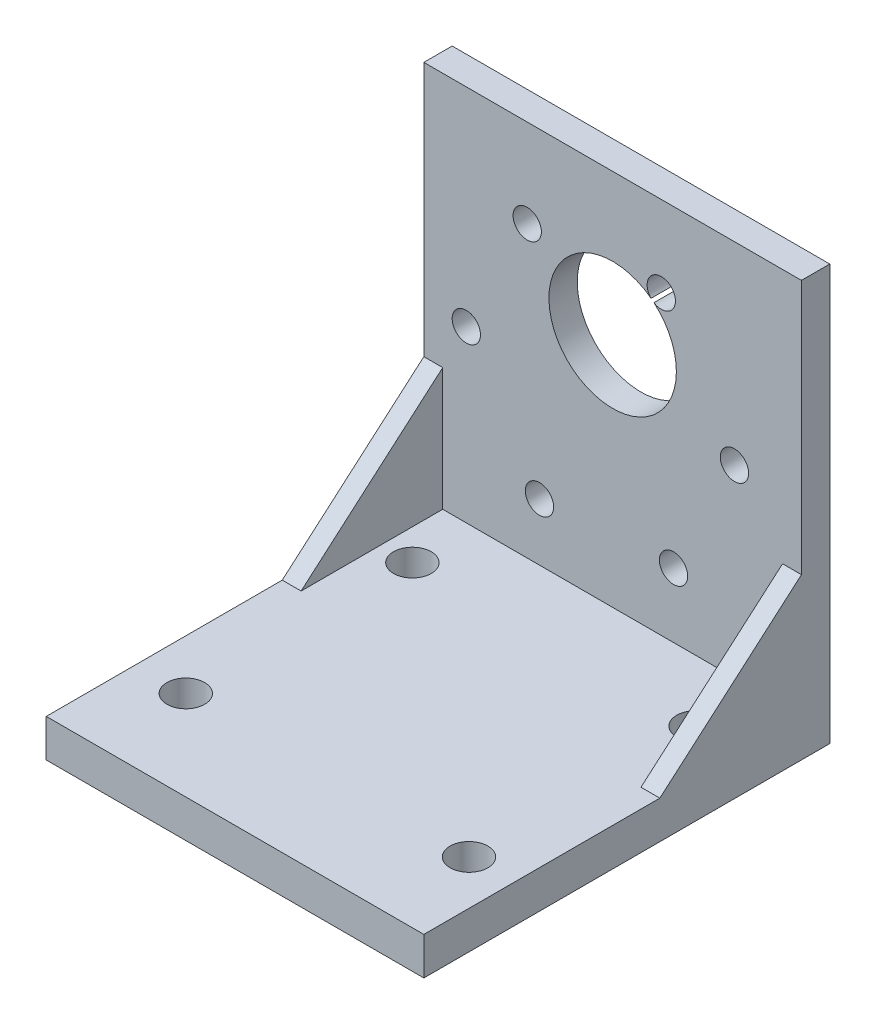
ISO-10303-21;
HEADER;
FILE_DESCRIPTION(('STEP AP214'),'2;1');
FILE_NAME('part.step','',(''),(''),'','','');
FILE_SCHEMA(('AUTOMOTIVE_DESIGN { 1 0 10303 214 1 1 1 1 }'));
ENDSEC;
DATA;
#1=APPLICATION_CONTEXT('core data for automotive mechanical design processes');
#2=APPLICATION_PROTOCOL_DEFINITION('international standard','automotive_design',2000,#1);
#3=PRODUCT_CONTEXT('',#1,'mechanical');
#4=PRODUCT('Part','Part','',(#3));
#5=PRODUCT_RELATED_PRODUCT_CATEGORY('part','',(#4));
#6=PRODUCT_DEFINITION_FORMATION('','',#4);
#7=PRODUCT_DEFINITION_CONTEXT('part definition',#1,'design');
#8=PRODUCT_DEFINITION('design','',#6,#7);
#9=PRODUCT_DEFINITION_SHAPE('','',#8);
#10=(LENGTH_UNIT() NAMED_UNIT(*) SI_UNIT(.MILLI.,.METRE.));
#11=(NAMED_UNIT(*) PLANE_ANGLE_UNIT() SI_UNIT($,.RADIAN.));
#12=(NAMED_UNIT(*) SI_UNIT($,.STERADIAN.) SOLID_ANGLE_UNIT());
#13=UNCERTAINTY_MEASURE_WITH_UNIT(LENGTH_MEASURE(1.E-05),#10,'distance_accuracy_value','');
#14=(GEOMETRIC_REPRESENTATION_CONTEXT(3) GLOBAL_UNCERTAINTY_ASSIGNED_CONTEXT((#13)) GLOBAL_UNIT_ASSIGNED_CONTEXT((#10,
#11,#12)) REPRESENTATION_CONTEXT('',''));
#15=CARTESIAN_POINT('',(0.,0.,0.));
#16=DIRECTION('',(0.,0.,1.));
#17=DIRECTION('',(1.,0.,0.));
#18=AXIS2_PLACEMENT_3D('',#15,#16,#17);
#19=CARTESIAN_POINT('',(0.,-4.,21.5));
#20=DIRECTION('',(0.,0.,1.));
#21=DIRECTION('',(1.,0.,0.));
#22=AXIS2_PLACEMENT_3D('',#19,#20,#21);
#23=PLANE('',#22);
#24=DIRECTION('',(1.,0.,0.));
#25=VECTOR('',#24,1.);
#26=CARTESIAN_POINT('',(0.,0.,21.5));
#27=LINE('',#26,#25);
#28=CARTESIAN_POINT('',(-20.,0.,21.5));
#29=VERTEX_POINT('',#28);
#30=CARTESIAN_POINT('',(20.,0.,21.5));
#31=VERTEX_POINT('',#30);
#32=EDGE_CURVE('E248',#29,#31,#27,.T.);
#33=ORIENTED_EDGE('',*,*,#32,.F.);
#34=DIRECTION('',(0.,1.,0.));
#35=VECTOR('',#34,1.);
#36=CARTESIAN_POINT('',(-20.,-4.,21.5));
#37=LINE('',#36,#35);
#38=CARTESIAN_POINT('',(-20.,-4.,21.5));
#39=VERTEX_POINT('',#38);
#40=EDGE_CURVE('E255',#39,#29,#37,.T.);
#41=ORIENTED_EDGE('',*,*,#40,.F.);
#42=DIRECTION('',(1.,0.,0.));
#43=VECTOR('',#42,1.);
#44=CARTESIAN_POINT('',(0.,-4.,21.5));
#45=LINE('',#44,#43);
#46=CARTESIAN_POINT('',(20.,-4.,21.5));
#47=VERTEX_POINT('',#46);
#48=EDGE_CURVE('E225',#39,#47,#45,.T.);
#49=ORIENTED_EDGE('',*,*,#48,.T.);
#50=DIRECTION('',(0.,1.,0.));
#51=VECTOR('',#50,1.);
#52=CARTESIAN_POINT('',(20.,-4.,21.5));
#53=LINE('',#52,#51);
#54=EDGE_CURVE('E236',#47,#31,#53,.T.);
#55=ORIENTED_EDGE('',*,*,#54,.T.);
#56=EDGE_LOOP('',(#33,#41,#49,#55));
#57=FACE_BOUND('',#56,.T.);
#58=ADVANCED_FACE('F35',(#57),#23,.T.);
#59=CARTESIAN_POINT('',(-20.,-4.,0.));
#60=DIRECTION('',(1.,0.,0.));
#61=DIRECTION('',(0.,0.,-1.));
#62=AXIS2_PLACEMENT_3D('',#59,#60,#61);
#63=PLANE('',#62);
#64=DIRECTION('',(0.,0.,-1.));
#65=VECTOR('',#64,1.);
#66=CARTESIAN_POINT('',(-20.,0.,0.));
#67=LINE('',#66,#65);
#68=CARTESIAN_POINT('',(-20.,0.,-3.5));
#69=VERTEX_POINT('',#68);
#70=EDGE_CURVE('E216',#29,#69,#67,.T.);
#71=ORIENTED_EDGE('',*,*,#70,.T.);
#72=DIRECTION('',(0.,0.654930538417842,-0.755689082789818));
#73=VECTOR('',#72,1.);
#74=CARTESIAN_POINT('',(-20.,13.,-18.5));
#75=LINE('',#74,#73);
#76=CARTESIAN_POINT('',(-20.,13.,-18.5));
#77=VERTEX_POINT('',#76);
#78=EDGE_CURVE('E349',#69,#77,#75,.T.);
#79=ORIENTED_EDGE('',*,*,#78,.T.);
#80=DIRECTION('',(0.,-1.,0.));
#81=VECTOR('',#80,1.);
#82=CARTESIAN_POINT('',(-20.,40.,-18.5));
#83=LINE('',#82,#81);
#84=CARTESIAN_POINT('',(-20.,40.,-18.5));
#85=VERTEX_POINT('',#84);
#86=EDGE_CURVE('E209',#85,#77,#83,.T.);
#87=ORIENTED_EDGE('',*,*,#86,.F.);
#88=DIRECTION('',(0.,0.,1.));
#89=VECTOR('',#88,1.);
#90=CARTESIAN_POINT('',(-20.,40.,0.));
#91=LINE('',#90,#89);
#92=CARTESIAN_POINT('',(-20.,40.,-21.5));
#93=VERTEX_POINT('',#92);
#94=EDGE_CURVE('E195',#93,#85,#91,.T.);
#95=ORIENTED_EDGE('',*,*,#94,.F.);
#96=DIRECTION('',(0.,1.,0.));
#97=VECTOR('',#96,1.);
#98=CARTESIAN_POINT('',(-20.,-4.,-21.5));
#99=LINE('',#98,#97);
#100=CARTESIAN_POINT('',(-20.,-4.,-21.5));
#101=VERTEX_POINT('',#100);
#102=EDGE_CURVE('E257',#101,#93,#99,.T.);
#103=ORIENTED_EDGE('',*,*,#102,.F.);
#104=DIRECTION('',(0.,0.,-1.));
#105=VECTOR('',#104,1.);
#106=CARTESIAN_POINT('',(-20.,-4.,0.));
#107=LINE('',#106,#105);
#108=EDGE_CURVE('E233',#39,#101,#107,.T.);
#109=ORIENTED_EDGE('',*,*,#108,.F.);
#110=ORIENTED_EDGE('',*,*,#40,.T.);
#111=EDGE_LOOP('',(#71,#79,#87,#95,#103,#109,#110));
#112=FACE_BOUND('',#111,.T.);
#113=ADVANCED_FACE('F290',(#112),#63,.F.);
#114=CARTESIAN_POINT('',(0.,-4.,-21.5));
#115=DIRECTION('',(0.,0.,1.));
#116=DIRECTION('',(1.,0.,0.));
#117=AXIS2_PLACEMENT_3D('',#114,#115,#116);
#118=PLANE('',#117);
#119=CARTESIAN_POINT('',(-7.74999999999997,6.0766062413414,-21.5));
#120=DIRECTION('',(0.,0.,1.));
#121=DIRECTION('',(1.,0.,0.));
#122=AXIS2_PLACEMENT_3D('',#119,#120,#121);
#123=CIRCLE('',#122,1.5);
#124=CARTESIAN_POINT('',(-6.24999999999997,6.0766062413414,-21.5));
#125=VERTEX_POINT('',#124);
#126=EDGE_CURVE('E186',#125,#125,#123,.T.);
#127=ORIENTED_EDGE('',*,*,#126,.T.);
#128=EDGE_LOOP('',(#127));
#129=FACE_BOUND('',#128,.T.);
#130=CARTESIAN_POINT('',(-15.5,18.,-21.5));
#131=DIRECTION('',(0.,0.,1.));
#132=DIRECTION('',(1.,0.,0.));
#133=AXIS2_PLACEMENT_3D('',#130,#131,#132);
#134=CIRCLE('',#133,1.5);
#135=CARTESIAN_POINT('',(-14.,18.,-21.5));
#136=VERTEX_POINT('',#135);
#137=EDGE_CURVE('E183',#136,#136,#134,.T.);
#138=ORIENTED_EDGE('',*,*,#137,.T.);
#139=EDGE_LOOP('',(#138));
#140=FACE_BOUND('',#139,.T.);
#141=CARTESIAN_POINT('',(-9.04903810567684,30.6733937586587,-21.5));
#142=DIRECTION('',(0.,0.,1.));
#143=DIRECTION('',(1.,0.,0.));
#144=AXIS2_PLACEMENT_3D('',#141,#142,#143);
#145=CIRCLE('',#144,1.5);
#146=CARTESIAN_POINT('',(-7.54903810567684,30.6733937586587,-21.5));
#147=VERTEX_POINT('',#146);
#148=EDGE_CURVE('E180',#147,#147,#145,.T.);
#149=ORIENTED_EDGE('',*,*,#148,.T.);
#150=EDGE_LOOP('',(#149));
#151=FACE_BOUND('',#150,.T.);
#152=CARTESIAN_POINT('',(12.9019237886464,19.5000000000003,-21.5));
#153=DIRECTION('',(0.,0.,1.));
#154=DIRECTION('',(1.,0.,0.));
#155=AXIS2_PLACEMENT_3D('',#152,#153,#154);
#156=CIRCLE('',#155,1.5);
#157=CARTESIAN_POINT('',(14.4019237886464,19.5000000000003,-21.5));
#158=VERTEX_POINT('',#157);
#159=EDGE_CURVE('E177',#158,#158,#156,.T.);
#160=ORIENTED_EDGE('',*,*,#159,.T.);
#161=EDGE_LOOP('',(#160));
#162=FACE_BOUND('',#161,.T.);
#163=CARTESIAN_POINT('',(6.45096189432323,6.82660624134153,-21.5));
#164=DIRECTION('',(0.,0.,1.));
#165=DIRECTION('',(1.,0.,0.));
#166=AXIS2_PLACEMENT_3D('',#163,#164,#165);
#167=CIRCLE('',#166,1.5);
#168=CARTESIAN_POINT('',(7.95096189432323,6.82660624134153,-21.5));
#169=VERTEX_POINT('',#168);
#170=EDGE_CURVE('E174',#169,#169,#167,.T.);
#171=ORIENTED_EDGE('',*,*,#170,.T.);
#172=EDGE_LOOP('',(#171));
#173=FACE_BOUND('',#172,.T.);
#174=CARTESIAN_POINT('',(0.,25.,-21.5));
#175=DIRECTION('',(0.,0.,1.));
#176=DIRECTION('',(1.,0.,0.));
#177=AXIS2_PLACEMENT_3D('',#174,#175,#176);
#178=CIRCLE('',#177,6.75);
#179=CARTESIAN_POINT('',(4.06822772576738,30.3862810148838,-21.5));
#180=VERTEX_POINT('',#179);
#181=CARTESIAN_POINT('',(4.37477437454332,30.1404133269455,-21.5));
#182=VERTEX_POINT('',#181);
#183=EDGE_CURVE('E192',#180,#182,#178,.T.);
#184=ORIENTED_EDGE('',*,*,#183,.T.);
#185=CARTESIAN_POINT('',(5.15192378864634,31.4233937586589,-21.5));
#186=DIRECTION('',(0.,0.,1.));
#187=DIRECTION('',(1.,0.,0.));
#188=AXIS2_PLACEMENT_3D('',#185,#186,#187);
#189=CIRCLE('',#188,1.5);
#190=EDGE_CURVE('E171',#182,#180,#189,.T.);
#191=ORIENTED_EDGE('',*,*,#190,.T.);
#192=EDGE_LOOP('',(#184,#191));
#193=FACE_BOUND('',#192,.T.);
#194=ORIENTED_EDGE('',*,*,#102,.T.);
#195=DIRECTION('',(-1.,0.,0.));
#196=VECTOR('',#195,1.);
#197=CARTESIAN_POINT('',(0.,40.,-21.5));
#198=LINE('',#197,#196);
#199=CARTESIAN_POINT('',(20.,40.,-21.5));
#200=VERTEX_POINT('',#199);
#201=EDGE_CURVE('E203',#200,#93,#198,.T.);
#202=ORIENTED_EDGE('',*,*,#201,.F.);
#203=DIRECTION('',(0.,1.,0.));
#204=VECTOR('',#203,1.);
#205=CARTESIAN_POINT('',(20.,-4.,-21.5));
#206=LINE('',#205,#204);
#207=CARTESIAN_POINT('',(20.,-4.,-21.5));
#208=VERTEX_POINT('',#207);
#209=EDGE_CURVE('E259',#208,#200,#206,.T.);
#210=ORIENTED_EDGE('',*,*,#209,.F.);
#211=DIRECTION('',(1.,0.,0.));
#212=VECTOR('',#211,1.);
#213=CARTESIAN_POINT('',(0.,-4.,-21.5));
#214=LINE('',#213,#212);
#215=EDGE_CURVE('E231',#101,#208,#214,.T.);
#216=ORIENTED_EDGE('',*,*,#215,.F.);
#217=EDGE_LOOP('',(#194,#202,#210,#216));
#218=FACE_BOUND('',#217,.T.);
#219=ADVANCED_FACE('F269',(#129,#140,#151,#162,#173,#193,#218),#118,.F.);
#220=CARTESIAN_POINT('',(-14.7150530034863,-4.,-12.));
#221=DIRECTION('',(0.,1.,0.));
#222=DIRECTION('',(0.,0.,1.));
#223=AXIS2_PLACEMENT_3D('',#220,#221,#222);
#224=CYLINDRICAL_SURFACE('',#223,2.);
#225=CARTESIAN_POINT('',(-14.7150530034863,-4.,-12.));
#226=DIRECTION('',(0.,1.,0.));
#227=DIRECTION('',(0.,0.,1.));
#228=AXIS2_PLACEMENT_3D('',#225,#226,#227);
#229=CIRCLE('',#228,2.);
#230=CARTESIAN_POINT('',(-14.7150530034863,-4.,-10.));
#231=VERTEX_POINT('',#230);
#232=EDGE_CURVE('E222',#231,#231,#229,.T.);
#233=ORIENTED_EDGE('',*,*,#232,.F.);
#234=EDGE_LOOP('',(#233));
#235=FACE_BOUND('',#234,.T.);
#236=CARTESIAN_POINT('',(-14.7150530034863,0.,-12.));
#237=DIRECTION('',(0.,1.,0.));
#238=DIRECTION('',(0.,0.,1.));
#239=AXIS2_PLACEMENT_3D('',#236,#237,#238);
#240=CIRCLE('',#239,2.);
#241=CARTESIAN_POINT('',(-14.7150530034863,0.,-10.));
#242=VERTEX_POINT('',#241);
#243=EDGE_CURVE('E245',#242,#242,#240,.T.);
#244=ORIENTED_EDGE('',*,*,#243,.T.);
#245=EDGE_LOOP('',(#244));
#246=FACE_BOUND('',#245,.T.);
#247=ADVANCED_FACE('F303',(#235,#246),#224,.F.);
#248=CARTESIAN_POINT('',(15.2849469965137,-4.,-12.));
#249=DIRECTION('',(0.,1.,0.));
#250=DIRECTION('',(0.,0.,1.));
#251=AXIS2_PLACEMENT_3D('',#248,#249,#250);
#252=CYLINDRICAL_SURFACE('',#251,2.);
#253=CARTESIAN_POINT('',(15.2849469965137,-4.,-12.));
#254=DIRECTION('',(0.,1.,0.));
#255=DIRECTION('',(0.,0.,1.));
#256=AXIS2_PLACEMENT_3D('',#253,#254,#255);
#257=CIRCLE('',#256,2.);
#258=CARTESIAN_POINT('',(15.2849469965137,-4.,-9.99999999999999));
#259=VERTEX_POINT('',#258);
#260=EDGE_CURVE('E219',#259,#259,#257,.T.);
#261=ORIENTED_EDGE('',*,*,#260,.F.);
#262=EDGE_LOOP('',(#261));
#263=FACE_BOUND('',#262,.T.);
#264=CARTESIAN_POINT('',(15.2849469965137,0.,-12.));
#265=DIRECTION('',(0.,1.,0.));
#266=DIRECTION('',(0.,0.,1.));
#267=AXIS2_PLACEMENT_3D('',#264,#265,#266);
#268=CIRCLE('',#267,2.);
#269=CARTESIAN_POINT('',(15.2849469965137,0.,-9.99999999999999));
#270=VERTEX_POINT('',#269);
#271=EDGE_CURVE('E242',#270,#270,#268,.T.);
#272=ORIENTED_EDGE('',*,*,#271,.T.);
#273=EDGE_LOOP('',(#272));
#274=FACE_BOUND('',#273,.T.);
#275=ADVANCED_FACE('F306',(#263,#274),#252,.F.);
#276=CARTESIAN_POINT('',(-14.7150530034863,-4.,12.));
#277=DIRECTION('',(0.,1.,0.));
#278=DIRECTION('',(0.,0.,1.));
#279=AXIS2_PLACEMENT_3D('',#276,#277,#278);
#280=CYLINDRICAL_SURFACE('',#279,2.);
#281=CARTESIAN_POINT('',(-14.7150530034863,-4.,12.));
#282=DIRECTION('',(0.,1.,0.));
#283=DIRECTION('',(0.,0.,1.));
#284=AXIS2_PLACEMENT_3D('',#281,#282,#283);
#285=CIRCLE('',#284,2.);
#286=CARTESIAN_POINT('',(-14.7150530034863,-4.,14.));
#287=VERTEX_POINT('',#286);
#288=EDGE_CURVE('E215',#287,#287,#285,.T.);
#289=ORIENTED_EDGE('',*,*,#288,.F.);
#290=EDGE_LOOP('',(#289));
#291=FACE_BOUND('',#290,.T.);
#292=CARTESIAN_POINT('',(-14.7150530034863,0.,12.));
#293=DIRECTION('',(0.,1.,0.));
#294=DIRECTION('',(0.,0.,1.));
#295=AXIS2_PLACEMENT_3D('',#292,#293,#294);
#296=CIRCLE('',#295,2.);
#297=CARTESIAN_POINT('',(-14.7150530034863,0.,14.));
#298=VERTEX_POINT('',#297);
#299=EDGE_CURVE('E239',#298,#298,#296,.T.);
#300=ORIENTED_EDGE('',*,*,#299,.T.);
#301=EDGE_LOOP('',(#300));
#302=FACE_BOUND('',#301,.T.);
#303=ADVANCED_FACE('F309',(#291,#302),#280,.F.);
#304=CARTESIAN_POINT('',(15.2849469965137,-4.,12.));
#305=DIRECTION('',(0.,1.,0.));
#306=DIRECTION('',(0.,0.,1.));
#307=AXIS2_PLACEMENT_3D('',#304,#305,#306);
#308=CYLINDRICAL_SURFACE('',#307,2.);
#309=CARTESIAN_POINT('',(15.2849469965137,-4.,12.));
#310=DIRECTION('',(0.,1.,0.));
#311=DIRECTION('',(0.,0.,1.));
#312=AXIS2_PLACEMENT_3D('',#309,#310,#311);
#313=CIRCLE('',#312,2.);
#314=CARTESIAN_POINT('',(15.2849469965137,-4.,14.));
#315=VERTEX_POINT('',#314);
#316=EDGE_CURVE('E212',#315,#315,#313,.T.);
#317=ORIENTED_EDGE('',*,*,#316,.F.);
#318=EDGE_LOOP('',(#317));
#319=FACE_BOUND('',#318,.T.);
#320=CARTESIAN_POINT('',(15.2849469965137,0.,12.));
#321=DIRECTION('',(0.,1.,0.));
#322=DIRECTION('',(0.,0.,1.));
#323=AXIS2_PLACEMENT_3D('',#320,#321,#322);
#324=CIRCLE('',#323,2.);
#325=CARTESIAN_POINT('',(15.2849469965137,0.,14.));
#326=VERTEX_POINT('',#325);
#327=EDGE_CURVE('E211',#326,#326,#324,.T.);
#328=ORIENTED_EDGE('',*,*,#327,.T.);
#329=EDGE_LOOP('',(#328));
#330=FACE_BOUND('',#329,.T.);
#331=ADVANCED_FACE('F37',(#319,#330),#308,.F.);
#332=CARTESIAN_POINT('',(20.,-4.,0.));
#333=DIRECTION('',(1.,0.,0.));
#334=DIRECTION('',(0.,0.,-1.));
#335=AXIS2_PLACEMENT_3D('',#332,#333,#334);
#336=PLANE('',#335);
#337=DIRECTION('',(0.,0.,-1.));
#338=VECTOR('',#337,1.);
#339=CARTESIAN_POINT('',(20.,0.,0.));
#340=LINE('',#339,#338);
#341=CARTESIAN_POINT('',(20.,0.,-3.5));
#342=VERTEX_POINT('',#341);
#343=EDGE_CURVE('E251',#31,#342,#340,.T.);
#344=ORIENTED_EDGE('',*,*,#343,.F.);
#345=ORIENTED_EDGE('',*,*,#54,.F.);
#346=DIRECTION('',(0.,0.,-1.));
#347=VECTOR('',#346,1.);
#348=CARTESIAN_POINT('',(20.,-4.,0.));
#349=LINE('',#348,#347);
#350=EDGE_CURVE('E228',#47,#208,#349,.T.);
#351=ORIENTED_EDGE('',*,*,#350,.T.);
#352=ORIENTED_EDGE('',*,*,#209,.T.);
#353=DIRECTION('',(0.,0.,-1.));
#354=VECTOR('',#353,1.);
#355=CARTESIAN_POINT('',(20.,40.,0.));
#356=LINE('',#355,#354);
#357=CARTESIAN_POINT('',(20.,40.,-18.5));
#358=VERTEX_POINT('',#357);
#359=EDGE_CURVE('E200',#358,#200,#356,.T.);
#360=ORIENTED_EDGE('',*,*,#359,.F.);
#361=DIRECTION('',(0.,-1.,0.));
#362=VECTOR('',#361,1.);
#363=CARTESIAN_POINT('',(20.,40.,-18.5));
#364=LINE('',#363,#362);
#365=CARTESIAN_POINT('',(20.,13.,-18.5));
#366=VERTEX_POINT('',#365);
#367=EDGE_CURVE('E206',#358,#366,#364,.T.);
#368=ORIENTED_EDGE('',*,*,#367,.T.);
#369=DIRECTION('',(0.,-0.654930538417842,0.755689082789818));
#370=VECTOR('',#369,1.);
#371=CARTESIAN_POINT('',(20.,13.,-18.5));
#372=LINE('',#371,#370);
#373=EDGE_CURVE('E129',#366,#342,#372,.T.);
#374=ORIENTED_EDGE('',*,*,#373,.T.);
#375=EDGE_LOOP('',(#344,#345,#351,#352,#360,#368,#374));
#376=FACE_BOUND('',#375,.T.);
#377=ADVANCED_FACE('F301',(#376),#336,.T.);
#378=CARTESIAN_POINT('',(0.,-4.,0.));
#379=DIRECTION('',(0.,1.,0.));
#380=DIRECTION('',(0.,0.,1.));
#381=AXIS2_PLACEMENT_3D('',#378,#379,#380);
#382=PLANE('',#381);
#383=ORIENTED_EDGE('',*,*,#316,.T.);
#384=EDGE_LOOP('',(#383));
#385=FACE_BOUND('',#384,.T.);
#386=ORIENTED_EDGE('',*,*,#288,.T.);
#387=EDGE_LOOP('',(#386));
#388=FACE_BOUND('',#387,.T.);
#389=ORIENTED_EDGE('',*,*,#260,.T.);
#390=EDGE_LOOP('',(#389));
#391=FACE_BOUND('',#390,.T.);
#392=ORIENTED_EDGE('',*,*,#232,.T.);
#393=EDGE_LOOP('',(#392));
#394=FACE_BOUND('',#393,.T.);
#395=ORIENTED_EDGE('',*,*,#48,.F.);
#396=ORIENTED_EDGE('',*,*,#108,.T.);
#397=ORIENTED_EDGE('',*,*,#215,.T.);
#398=ORIENTED_EDGE('',*,*,#350,.F.);
#399=EDGE_LOOP('',(#395,#396,#397,#398));
#400=FACE_BOUND('',#399,.T.);
#401=ADVANCED_FACE('F284',(#385,#388,#391,#394,#400),#382,.F.);
#402=CARTESIAN_POINT('',(0.,0.,0.));
#403=DIRECTION('',(0.,1.,0.));
#404=DIRECTION('',(0.,0.,1.));
#405=AXIS2_PLACEMENT_3D('',#402,#403,#404);
#406=PLANE('',#405);
#407=DIRECTION('',(-1.,0.,0.));
#408=VECTOR('',#407,1.);
#409=CARTESIAN_POINT('',(-18.,0.,-3.5));
#410=LINE('',#409,#408);
#411=CARTESIAN_POINT('',(-18.,0.,-3.5));
#412=VERTEX_POINT('',#411);
#413=EDGE_CURVE('E54',#412,#69,#410,.T.);
#414=ORIENTED_EDGE('',*,*,#413,.T.);
#415=ORIENTED_EDGE('',*,*,#70,.F.);
#416=ORIENTED_EDGE('',*,*,#32,.T.);
#417=ORIENTED_EDGE('',*,*,#343,.T.);
#418=DIRECTION('',(1.,0.,0.));
#419=VECTOR('',#418,1.);
#420=CARTESIAN_POINT('',(18.,0.,-3.5));
#421=LINE('',#420,#419);
#422=CARTESIAN_POINT('',(18.,0.,-3.5));
#423=VERTEX_POINT('',#422);
#424=EDGE_CURVE('E134',#423,#342,#421,.T.);
#425=ORIENTED_EDGE('',*,*,#424,.F.);
#426=DIRECTION('',(0.,0.,-1.));
#427=VECTOR('',#426,1.);
#428=CARTESIAN_POINT('',(18.,0.,-3.5));
#429=LINE('',#428,#427);
#430=CARTESIAN_POINT('',(18.,0.,-18.5));
#431=VERTEX_POINT('',#430);
#432=EDGE_CURVE('E135',#423,#431,#429,.T.);
#433=ORIENTED_EDGE('',*,*,#432,.T.);
#434=DIRECTION('',(1.,0.,0.));
#435=VECTOR('',#434,1.);
#436=CARTESIAN_POINT('',(0.,0.,-18.5));
#437=LINE('',#436,#435);
#438=CARTESIAN_POINT('',(-18.,0.,-18.5));
#439=VERTEX_POINT('',#438);
#440=EDGE_CURVE('E145',#439,#431,#437,.T.);
#441=ORIENTED_EDGE('',*,*,#440,.F.);
#442=DIRECTION('',(0.,0.,1.));
#443=VECTOR('',#442,1.);
#444=CARTESIAN_POINT('',(-18.,0.,-3.5));
#445=LINE('',#444,#443);
#446=EDGE_CURVE('E50',#439,#412,#445,.T.);
#447=ORIENTED_EDGE('',*,*,#446,.T.);
#448=EDGE_LOOP('',(#414,#415,#416,#417,#425,#433,#441,#447));
#449=FACE_BOUND('',#448,.T.);
#450=ORIENTED_EDGE('',*,*,#327,.F.);
#451=EDGE_LOOP('',(#450));
#452=FACE_BOUND('',#451,.T.);
#453=ORIENTED_EDGE('',*,*,#299,.F.);
#454=EDGE_LOOP('',(#453));
#455=FACE_BOUND('',#454,.T.);
#456=ORIENTED_EDGE('',*,*,#271,.F.);
#457=EDGE_LOOP('',(#456));
#458=FACE_BOUND('',#457,.T.);
#459=ORIENTED_EDGE('',*,*,#243,.F.);
#460=EDGE_LOOP('',(#459));
#461=FACE_BOUND('',#460,.T.);
#462=ADVANCED_FACE('F275',(#449,#452,#455,#458,#461),#406,.T.);
#463=CARTESIAN_POINT('',(0.,40.,-18.5));
#464=DIRECTION('',(0.,0.,-1.));
#465=DIRECTION('',(-1.,0.,0.));
#466=AXIS2_PLACEMENT_3D('',#463,#464,#465);
#467=PLANE('',#466);
#468=CARTESIAN_POINT('',(-7.74999999999997,6.0766062413414,-18.5));
#469=DIRECTION('',(0.,0.,1.));
#470=DIRECTION('',(1.,0.,0.));
#471=AXIS2_PLACEMENT_3D('',#468,#469,#470);
#472=CIRCLE('',#471,1.5);
#473=CARTESIAN_POINT('',(-6.24999999999997,6.0766062413414,-18.5));
#474=VERTEX_POINT('',#473);
#475=EDGE_CURVE('E153',#474,#474,#472,.T.);
#476=ORIENTED_EDGE('',*,*,#475,.F.);
#477=EDGE_LOOP('',(#476));
#478=FACE_BOUND('',#477,.T.);
#479=CARTESIAN_POINT('',(-15.5,18.,-18.5));
#480=DIRECTION('',(0.,0.,1.));
#481=DIRECTION('',(1.,0.,0.));
#482=AXIS2_PLACEMENT_3D('',#479,#480,#481);
#483=CIRCLE('',#482,1.5);
#484=CARTESIAN_POINT('',(-14.,18.,-18.5));
#485=VERTEX_POINT('',#484);
#486=EDGE_CURVE('E164',#485,#485,#483,.T.);
#487=ORIENTED_EDGE('',*,*,#486,.F.);
#488=EDGE_LOOP('',(#487));
#489=FACE_BOUND('',#488,.T.);
#490=CARTESIAN_POINT('',(-9.04903810567684,30.6733937586587,-18.5));
#491=DIRECTION('',(0.,0.,1.));
#492=DIRECTION('',(1.,0.,0.));
#493=AXIS2_PLACEMENT_3D('',#490,#491,#492);
#494=CIRCLE('',#493,1.5);
#495=CARTESIAN_POINT('',(-7.54903810567684,30.6733937586587,-18.5));
#496=VERTEX_POINT('',#495);
#497=EDGE_CURVE('E161',#496,#496,#494,.T.);
#498=ORIENTED_EDGE('',*,*,#497,.F.);
#499=EDGE_LOOP('',(#498));
#500=FACE_BOUND('',#499,.T.);
#501=CARTESIAN_POINT('',(12.9019237886464,19.5000000000003,-18.5));
#502=DIRECTION('',(0.,0.,1.));
#503=DIRECTION('',(1.,0.,0.));
#504=AXIS2_PLACEMENT_3D('',#501,#502,#503);
#505=CIRCLE('',#504,1.5);
#506=CARTESIAN_POINT('',(14.4019237886464,19.5000000000003,-18.5));
#507=VERTEX_POINT('',#506);
#508=EDGE_CURVE('E155',#507,#507,#505,.T.);
#509=ORIENTED_EDGE('',*,*,#508,.F.);
#510=EDGE_LOOP('',(#509));
#511=FACE_BOUND('',#510,.T.);
#512=CARTESIAN_POINT('',(6.45096189432323,6.82660624134153,-18.5));
#513=DIRECTION('',(0.,0.,1.));
#514=DIRECTION('',(1.,0.,0.));
#515=AXIS2_PLACEMENT_3D('',#512,#513,#514);
#516=CIRCLE('',#515,1.5);
#517=CARTESIAN_POINT('',(7.95096189432323,6.82660624134153,-18.5));
#518=VERTEX_POINT('',#517);
#519=EDGE_CURVE('E158',#518,#518,#516,.T.);
#520=ORIENTED_EDGE('',*,*,#519,.F.);
#521=EDGE_LOOP('',(#520));
#522=FACE_BOUND('',#521,.T.);
#523=CARTESIAN_POINT('',(0.,25.,-18.5));
#524=DIRECTION('',(0.,0.,1.));
#525=DIRECTION('',(1.,0.,0.));
#526=AXIS2_PLACEMENT_3D('',#523,#524,#525);
#527=CIRCLE('',#526,6.75);
#528=CARTESIAN_POINT('',(4.06822772576737,30.3862810148838,-18.5));
#529=VERTEX_POINT('',#528);
#530=CARTESIAN_POINT('',(4.37477437454332,30.1404133269455,-18.5));
#531=VERTEX_POINT('',#530);
#532=EDGE_CURVE('E189',#529,#531,#527,.T.);
#533=ORIENTED_EDGE('',*,*,#532,.F.);
#534=CARTESIAN_POINT('',(5.15192378864634,31.4233937586589,-18.5));
#535=DIRECTION('',(0.,0.,1.));
#536=DIRECTION('',(1.,0.,0.));
#537=AXIS2_PLACEMENT_3D('',#534,#535,#536);
#538=CIRCLE('',#537,1.5);
#539=EDGE_CURVE('E159',#531,#529,#538,.T.);
#540=ORIENTED_EDGE('',*,*,#539,.F.);
#541=EDGE_LOOP('',(#533,#540));
#542=FACE_BOUND('',#541,.T.);
#543=ORIENTED_EDGE('',*,*,#86,.T.);
#544=DIRECTION('',(-1.,0.,0.));
#545=VECTOR('',#544,1.);
#546=CARTESIAN_POINT('',(-18.,13.,-18.5));
#547=LINE('',#546,#545);
#548=CARTESIAN_POINT('',(-18.,13.,-18.5));
#549=VERTEX_POINT('',#548);
#550=EDGE_CURVE('E147',#549,#77,#547,.T.);
#551=ORIENTED_EDGE('',*,*,#550,.F.);
#552=DIRECTION('',(0.,-1.,0.));
#553=VECTOR('',#552,1.);
#554=CARTESIAN_POINT('',(-18.,0.,-18.5));
#555=LINE('',#554,#553);
#556=EDGE_CURVE('E355',#549,#439,#555,.T.);
#557=ORIENTED_EDGE('',*,*,#556,.T.);
#558=ORIENTED_EDGE('',*,*,#440,.T.);
#559=DIRECTION('',(0.,1.,0.));
#560=VECTOR('',#559,1.);
#561=CARTESIAN_POINT('',(18.,0.,-18.5));
#562=LINE('',#561,#560);
#563=CARTESIAN_POINT('',(18.,13.,-18.5));
#564=VERTEX_POINT('',#563);
#565=EDGE_CURVE('E140',#431,#564,#562,.T.);
#566=ORIENTED_EDGE('',*,*,#565,.T.);
#567=DIRECTION('',(1.,0.,0.));
#568=VECTOR('',#567,1.);
#569=CARTESIAN_POINT('',(18.,13.,-18.5));
#570=LINE('',#569,#568);
#571=EDGE_CURVE('E123',#564,#366,#570,.T.);
#572=ORIENTED_EDGE('',*,*,#571,.T.);
#573=ORIENTED_EDGE('',*,*,#367,.F.);
#574=DIRECTION('',(1.,0.,0.));
#575=VECTOR('',#574,1.);
#576=CARTESIAN_POINT('',(0.,40.,-18.5));
#577=LINE('',#576,#575);
#578=EDGE_CURVE('E198',#85,#358,#577,.T.);
#579=ORIENTED_EDGE('',*,*,#578,.F.);
#580=EDGE_LOOP('',(#543,#551,#557,#558,#566,#572,#573,#579));
#581=FACE_BOUND('',#580,.T.);
#582=ADVANCED_FACE('F144',(#478,#489,#500,#511,#522,#542,#581),#467,.F.);
#583=CARTESIAN_POINT('',(0.,40.,0.));
#584=DIRECTION('',(0.,1.,0.));
#585=DIRECTION('',(0.,0.,1.));
#586=AXIS2_PLACEMENT_3D('',#583,#584,#585);
#587=PLANE('',#586);
#588=ORIENTED_EDGE('',*,*,#94,.T.);
#589=ORIENTED_EDGE('',*,*,#578,.T.);
#590=ORIENTED_EDGE('',*,*,#359,.T.);
#591=ORIENTED_EDGE('',*,*,#201,.T.);
#592=EDGE_LOOP('',(#588,#589,#590,#591));
#593=FACE_BOUND('',#592,.T.);
#594=ADVANCED_FACE('F274',(#593),#587,.T.);
#595=CARTESIAN_POINT('',(0.,25.,-52.5));
#596=DIRECTION('',(0.,0.,1.));
#597=DIRECTION('',(1.,0.,0.));
#598=AXIS2_PLACEMENT_3D('',#595,#596,#597);
#599=CYLINDRICAL_SURFACE('',#598,6.75);
#600=ORIENTED_EDGE('',*,*,#183,.F.);
#601=DIRECTION('',(0.,0.,1.));
#602=VECTOR('',#601,1.);
#603=CARTESIAN_POINT('',(4.06822772576738,30.3862810148838,-23.5));
#604=LINE('',#603,#602);
#605=EDGE_CURVE('E11',#180,#529,#604,.T.);
#606=ORIENTED_EDGE('',*,*,#605,.T.);
#607=ORIENTED_EDGE('',*,*,#532,.T.);
#608=DIRECTION('',(0.,0.,1.));
#609=VECTOR('',#608,1.);
#610=CARTESIAN_POINT('',(4.37477437454332,30.1404133269455,-23.5));
#611=LINE('',#610,#609);
#612=EDGE_CURVE('E43',#531,#182,#611,.F.);
#613=ORIENTED_EDGE('',*,*,#612,.T.);
#614=EDGE_LOOP('',(#600,#606,#607,#613));
#615=FACE_BOUND('',#614,.T.);
#616=ADVANCED_FACE('F264',(#615),#599,.F.);
#617=CARTESIAN_POINT('',(5.15192378864634,31.4233937586589,-28.5));
#618=DIRECTION('',(0.,0.,1.));
#619=DIRECTION('',(1.,0.,0.));
#620=AXIS2_PLACEMENT_3D('',#617,#618,#619);
#621=CYLINDRICAL_SURFACE('',#620,1.5);
#622=ORIENTED_EDGE('',*,*,#190,.F.);
#623=ORIENTED_EDGE('',*,*,#612,.F.);
#624=ORIENTED_EDGE('',*,*,#539,.T.);
#625=ORIENTED_EDGE('',*,*,#605,.F.);
#626=EDGE_LOOP('',(#622,#623,#624,#625));
#627=FACE_BOUND('',#626,.T.);
#628=ADVANCED_FACE('F271',(#627),#621,.F.);
#629=CARTESIAN_POINT('',(6.45096189432323,6.82660624134153,-28.5));
#630=DIRECTION('',(0.,0.,1.));
#631=DIRECTION('',(1.,0.,0.));
#632=AXIS2_PLACEMENT_3D('',#629,#630,#631);
#633=CYLINDRICAL_SURFACE('',#632,1.5);
#634=ORIENTED_EDGE('',*,*,#519,.T.);
#635=EDGE_LOOP('',(#634));
#636=FACE_BOUND('',#635,.T.);
#637=ORIENTED_EDGE('',*,*,#170,.F.);
#638=EDGE_LOOP('',(#637));
#639=FACE_BOUND('',#638,.T.);
#640=ADVANCED_FACE('F380',(#636,#639),#633,.F.);
#641=CARTESIAN_POINT('',(12.9019237886464,19.5000000000003,-28.5));
#642=DIRECTION('',(0.,0.,1.));
#643=DIRECTION('',(1.,0.,0.));
#644=AXIS2_PLACEMENT_3D('',#641,#642,#643);
#645=CYLINDRICAL_SURFACE('',#644,1.5);
#646=ORIENTED_EDGE('',*,*,#508,.T.);
#647=EDGE_LOOP('',(#646));
#648=FACE_BOUND('',#647,.T.);
#649=ORIENTED_EDGE('',*,*,#159,.F.);
#650=EDGE_LOOP('',(#649));
#651=FACE_BOUND('',#650,.T.);
#652=ADVANCED_FACE('F376',(#648,#651),#645,.F.);
#653=CARTESIAN_POINT('',(-9.04903810567684,30.6733937586587,-28.5));
#654=DIRECTION('',(0.,0.,1.));
#655=DIRECTION('',(1.,0.,0.));
#656=AXIS2_PLACEMENT_3D('',#653,#654,#655);
#657=CYLINDRICAL_SURFACE('',#656,1.5);
#658=ORIENTED_EDGE('',*,*,#497,.T.);
#659=EDGE_LOOP('',(#658));
#660=FACE_BOUND('',#659,.T.);
#661=ORIENTED_EDGE('',*,*,#148,.F.);
#662=EDGE_LOOP('',(#661));
#663=FACE_BOUND('',#662,.T.);
#664=ADVANCED_FACE('F379',(#660,#663),#657,.F.);
#665=CARTESIAN_POINT('',(-15.5,18.,-28.5));
#666=DIRECTION('',(0.,0.,1.));
#667=DIRECTION('',(1.,0.,0.));
#668=AXIS2_PLACEMENT_3D('',#665,#666,#667);
#669=CYLINDRICAL_SURFACE('',#668,1.5);
#670=ORIENTED_EDGE('',*,*,#486,.T.);
#671=EDGE_LOOP('',(#670));
#672=FACE_BOUND('',#671,.T.);
#673=ORIENTED_EDGE('',*,*,#137,.F.);
#674=EDGE_LOOP('',(#673));
#675=FACE_BOUND('',#674,.T.);
#676=ADVANCED_FACE('F386',(#672,#675),#669,.F.);
#677=CARTESIAN_POINT('',(-7.74999999999997,6.0766062413414,-28.5));
#678=DIRECTION('',(0.,0.,1.));
#679=DIRECTION('',(1.,0.,0.));
#680=AXIS2_PLACEMENT_3D('',#677,#678,#679);
#681=CYLINDRICAL_SURFACE('',#680,1.5);
#682=ORIENTED_EDGE('',*,*,#475,.T.);
#683=EDGE_LOOP('',(#682));
#684=FACE_BOUND('',#683,.T.);
#685=ORIENTED_EDGE('',*,*,#126,.F.);
#686=EDGE_LOOP('',(#685));
#687=FACE_BOUND('',#686,.T.);
#688=ADVANCED_FACE('F375',(#684,#687),#681,.F.);
#689=CARTESIAN_POINT('',(18.,13.,-18.5));
#690=DIRECTION('',(0.,0.755689082789818,0.654930538417842));
#691=DIRECTION('',(0.,-0.654930538417842,0.755689082789818));
#692=AXIS2_PLACEMENT_3D('',#689,#690,#691);
#693=PLANE('',#692);
#694=ORIENTED_EDGE('',*,*,#373,.F.);
#695=ORIENTED_EDGE('',*,*,#571,.F.);
#696=DIRECTION('',(0.,-0.654930538417842,0.755689082789818));
#697=VECTOR('',#696,1.);
#698=CARTESIAN_POINT('',(18.,13.,-18.5));
#699=LINE('',#698,#697);
#700=EDGE_CURVE('E126',#564,#423,#699,.T.);
#701=ORIENTED_EDGE('',*,*,#700,.T.);
#702=ORIENTED_EDGE('',*,*,#424,.T.);
#703=EDGE_LOOP('',(#694,#695,#701,#702));
#704=FACE_BOUND('',#703,.T.);
#705=ADVANCED_FACE('F125',(#704),#693,.T.);
#706=CARTESIAN_POINT('',(18.,0.,0.));
#707=DIRECTION('',(-1.,0.,0.));
#708=DIRECTION('',(0.,0.,1.));
#709=AXIS2_PLACEMENT_3D('',#706,#707,#708);
#710=PLANE('',#709);
#711=ORIENTED_EDGE('',*,*,#565,.F.);
#712=ORIENTED_EDGE('',*,*,#432,.F.);
#713=ORIENTED_EDGE('',*,*,#700,.F.);
#714=EDGE_LOOP('',(#711,#712,#713));
#715=FACE_BOUND('',#714,.T.);
#716=ADVANCED_FACE('F139',(#715),#710,.T.);
#717=CARTESIAN_POINT('',(-18.,13.,-18.5));
#718=DIRECTION('',(0.,0.755689082789818,0.654930538417842));
#719=DIRECTION('',(0.,-0.654930538417842,0.755689082789818));
#720=AXIS2_PLACEMENT_3D('',#717,#718,#719);
#721=PLANE('',#720);
#722=ORIENTED_EDGE('',*,*,#78,.F.);
#723=ORIENTED_EDGE('',*,*,#413,.F.);
#724=DIRECTION('',(0.,0.654930538417842,-0.755689082789818));
#725=VECTOR('',#724,1.);
#726=CARTESIAN_POINT('',(-18.,13.,-18.5));
#727=LINE('',#726,#725);
#728=EDGE_CURVE('E359',#412,#549,#727,.T.);
#729=ORIENTED_EDGE('',*,*,#728,.T.);
#730=ORIENTED_EDGE('',*,*,#550,.T.);
#731=EDGE_LOOP('',(#722,#723,#729,#730));
#732=FACE_BOUND('',#731,.T.);
#733=ADVANCED_FACE('F352',(#732),#721,.T.);
#734=CARTESIAN_POINT('',(-18.,0.,0.));
#735=DIRECTION('',(-1.,0.,0.));
#736=DIRECTION('',(0.,0.,1.));
#737=AXIS2_PLACEMENT_3D('',#734,#735,#736);
#738=PLANE('',#737);
#739=ORIENTED_EDGE('',*,*,#556,.F.);
#740=ORIENTED_EDGE('',*,*,#728,.F.);
#741=ORIENTED_EDGE('',*,*,#446,.F.);
#742=EDGE_LOOP('',(#739,#740,#741));
#743=FACE_BOUND('',#742,.T.);
#744=ADVANCED_FACE('F363',(#743),#738,.F.);
#745=CLOSED_SHELL('',(#58,#113,#219,#247,#275,#303,#331,#377,#401,#462,#582,#594,#616,#628,#640,
#652,#664,#676,#688,#705,#716,#733,#744));
#746=MANIFOLD_SOLID_BREP('B2',#745);
#747=ADVANCED_BREP_SHAPE_REPRESENTATION('',(#18,#746),#14);
#748=SHAPE_DEFINITION_REPRESENTATION(#9,#747);
ENDSEC;
END-ISO-10303-21;
